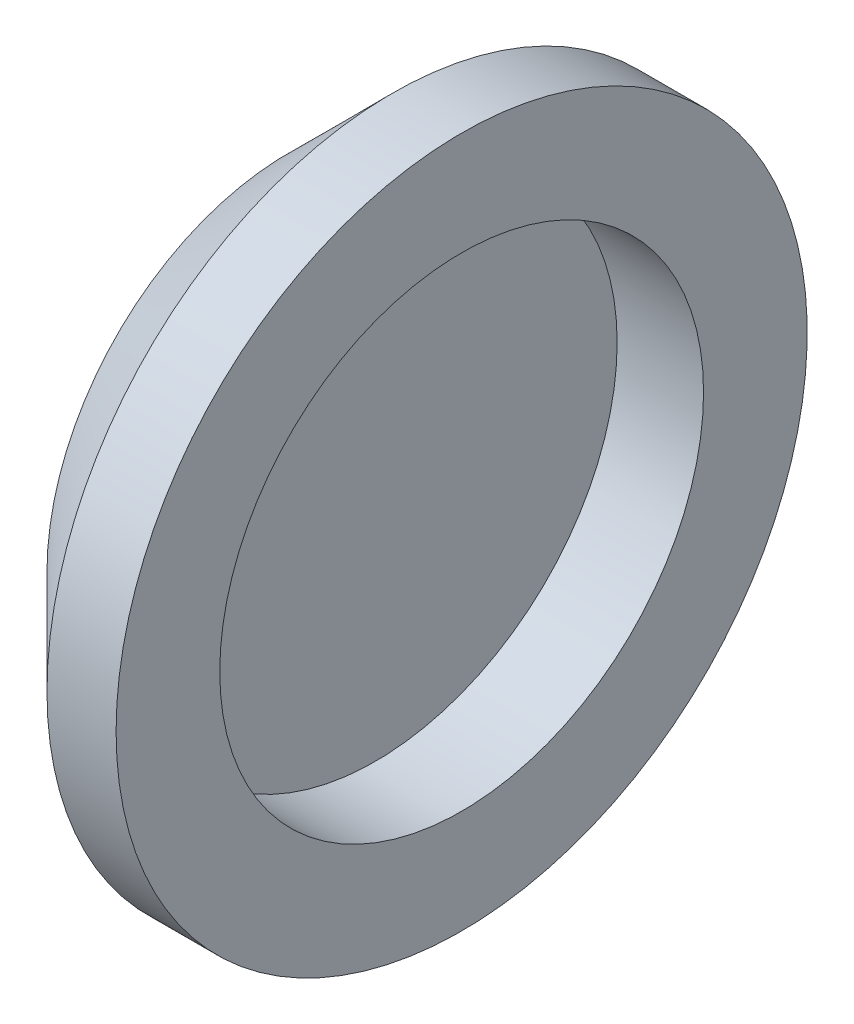
ISO-10303-21;
HEADER;
FILE_DESCRIPTION(('STEP AP214'),'2;1');
FILE_NAME('part.step','',(''),(''),'','','');
FILE_SCHEMA(('AUTOMOTIVE_DESIGN { 1 0 10303 214 1 1 1 1 }'));
ENDSEC;
DATA;
#1=APPLICATION_CONTEXT('core data for automotive mechanical design processes');
#2=APPLICATION_PROTOCOL_DEFINITION('international standard','automotive_design',2000,#1);
#3=PRODUCT_CONTEXT('',#1,'mechanical');
#4=PRODUCT('Part','Part','',(#3));
#5=PRODUCT_RELATED_PRODUCT_CATEGORY('part','',(#4));
#6=PRODUCT_DEFINITION_FORMATION('','',#4);
#7=PRODUCT_DEFINITION_CONTEXT('part definition',#1,'design');
#8=PRODUCT_DEFINITION('design','',#6,#7);
#9=PRODUCT_DEFINITION_SHAPE('','',#8);
#10=(LENGTH_UNIT() NAMED_UNIT(*) SI_UNIT(.MILLI.,.METRE.));
#11=(NAMED_UNIT(*) PLANE_ANGLE_UNIT() SI_UNIT($,.RADIAN.));
#12=(NAMED_UNIT(*) SI_UNIT($,.STERADIAN.) SOLID_ANGLE_UNIT());
#13=UNCERTAINTY_MEASURE_WITH_UNIT(LENGTH_MEASURE(1.E-05),#10,'distance_accuracy_value','');
#14=(GEOMETRIC_REPRESENTATION_CONTEXT(3) GLOBAL_UNCERTAINTY_ASSIGNED_CONTEXT((#13)) GLOBAL_UNIT_ASSIGNED_CONTEXT((#10,
#11,#12)) REPRESENTATION_CONTEXT('',''));
#15=CARTESIAN_POINT('',(0.,0.,0.));
#16=DIRECTION('',(0.,0.,1.));
#17=DIRECTION('',(1.,0.,0.));
#18=AXIS2_PLACEMENT_3D('',#15,#16,#17);
#19=CARTESIAN_POINT('',(0.,0.,0.));
#20=DIRECTION('',(-1.,0.,0.));
#21=DIRECTION('',(0.,0.,1.));
#22=AXIS2_PLACEMENT_3D('',#19,#20,#21);
#23=PLANE('',#22);
#24=CARTESIAN_POINT('',(0.,0.,0.));
#25=DIRECTION('',(1.,0.,0.));
#26=DIRECTION('',(0.,0.,-1.));
#27=AXIS2_PLACEMENT_3D('',#24,#25,#26);
#28=CIRCLE('',#27,3.556);
#29=CARTESIAN_POINT('',(0.,0.,-3.556));
#30=VERTEX_POINT('',#29);
#31=EDGE_CURVE('E63',#30,#30,#28,.T.);
#32=ORIENTED_EDGE('',*,*,#31,.F.);
#33=EDGE_LOOP('',(#32));
#34=FACE_BOUND('',#33,.T.);
#35=CARTESIAN_POINT('',(0.,0.,0.));
#36=DIRECTION('',(-1.,0.,0.));
#37=DIRECTION('',(0.,0.,1.));
#38=AXIS2_PLACEMENT_3D('',#35,#36,#37);
#39=CIRCLE('',#38,5.08);
#40=CARTESIAN_POINT('',(0.,0.,5.08));
#41=VERTEX_POINT('',#40);
#42=EDGE_CURVE('E10',#41,#41,#39,.T.);
#43=ORIENTED_EDGE('',*,*,#42,.F.);
#44=EDGE_LOOP('',(#43));
#45=FACE_BOUND('',#44,.T.);
#46=ADVANCED_FACE('F43',(#34,#45),#23,.F.);
#47=CARTESIAN_POINT('',(-2.54,0.,0.));
#48=DIRECTION('',(-1.,0.,0.));
#49=DIRECTION('',(0.,0.,1.));
#50=AXIS2_PLACEMENT_3D('',#47,#48,#49);
#51=CYLINDRICAL_SURFACE('',#50,5.08);
#52=CARTESIAN_POINT('',(-1.016,0.,0.));
#53=DIRECTION('',(-1.,0.,0.));
#54=DIRECTION('',(0.,0.,1.));
#55=AXIS2_PLACEMENT_3D('',#52,#53,#54);
#56=CIRCLE('',#55,5.08);
#57=CARTESIAN_POINT('',(-1.016,0.,5.08));
#58=VERTEX_POINT('',#57);
#59=EDGE_CURVE('E50',#58,#58,#56,.T.);
#60=ORIENTED_EDGE('',*,*,#59,.F.);
#61=EDGE_LOOP('',(#60));
#62=FACE_BOUND('',#61,.T.);
#63=ORIENTED_EDGE('',*,*,#42,.T.);
#64=EDGE_LOOP('',(#63));
#65=FACE_BOUND('',#64,.T.);
#66=ADVANCED_FACE('F82',(#62,#65),#51,.T.);
#67=CARTESIAN_POINT('',(-1.016,0.,0.));
#68=DIRECTION('',(1.,0.,0.));
#69=DIRECTION('',(0.,0.,-1.));
#70=AXIS2_PLACEMENT_3D('',#67,#68,#69);
#71=CONICAL_SURFACE('',#70,5.08,0.785398163397449);
#72=CARTESIAN_POINT('',(-2.54,0.,0.));
#73=DIRECTION('',(-1.,0.,0.));
#74=DIRECTION('',(0.,0.,1.));
#75=AXIS2_PLACEMENT_3D('',#72,#73,#74);
#76=CIRCLE('',#75,3.556);
#77=CARTESIAN_POINT('',(-2.54,0.,3.556));
#78=VERTEX_POINT('',#77);
#79=EDGE_CURVE('E55',#78,#78,#76,.T.);
#80=ORIENTED_EDGE('',*,*,#79,.F.);
#81=EDGE_LOOP('',(#80));
#82=FACE_BOUND('',#81,.T.);
#83=ORIENTED_EDGE('',*,*,#59,.T.);
#84=EDGE_LOOP('',(#83));
#85=FACE_BOUND('',#84,.T.);
#86=ADVANCED_FACE('F87',(#82,#85),#71,.T.);
#87=CARTESIAN_POINT('',(-2.54,3.556,0.));
#88=DIRECTION('',(1.,0.,0.));
#89=DIRECTION('',(0.,0.,-1.));
#90=AXIS2_PLACEMENT_3D('',#87,#88,#89);
#91=PLANE('',#90);
#92=ORIENTED_EDGE('',*,*,#79,.T.);
#93=EDGE_LOOP('',(#92));
#94=FACE_BOUND('',#93,.T.);
#95=ADVANCED_FACE('F76',(#94),#91,.F.);
#96=CARTESIAN_POINT('',(-1.27,0.,0.));
#97=DIRECTION('',(1.,0.,0.));
#98=DIRECTION('',(0.,0.,-1.));
#99=AXIS2_PLACEMENT_3D('',#96,#97,#98);
#100=CYLINDRICAL_SURFACE('',#99,3.556);
#101=CARTESIAN_POINT('',(-1.27,0.,0.));
#102=DIRECTION('',(1.,0.,0.));
#103=DIRECTION('',(0.,0.,-1.));
#104=AXIS2_PLACEMENT_3D('',#101,#102,#103);
#105=CIRCLE('',#104,3.556);
#106=CARTESIAN_POINT('',(-1.27,0.,-3.556));
#107=VERTEX_POINT('',#106);
#108=EDGE_CURVE('E60',#107,#107,#105,.T.);
#109=ORIENTED_EDGE('',*,*,#108,.F.);
#110=EDGE_LOOP('',(#109));
#111=FACE_BOUND('',#110,.T.);
#112=ORIENTED_EDGE('',*,*,#31,.T.);
#113=EDGE_LOOP('',(#112));
#114=FACE_BOUND('',#113,.T.);
#115=ADVANCED_FACE('F73',(#111,#114),#100,.F.);
#116=CARTESIAN_POINT('',(-1.27,0.,0.));
#117=DIRECTION('',(1.,0.,0.));
#118=DIRECTION('',(0.,0.,-1.));
#119=AXIS2_PLACEMENT_3D('',#116,#117,#118);
#120=PLANE('',#119);
#121=ORIENTED_EDGE('',*,*,#108,.T.);
#122=EDGE_LOOP('',(#121));
#123=FACE_BOUND('',#122,.T.);
#124=ADVANCED_FACE('F71',(#123),#120,.T.);
#125=CLOSED_SHELL('',(#46,#66,#86,#95,#115,#124));
#126=MANIFOLD_SOLID_BREP('B2',#125);
#127=ADVANCED_BREP_SHAPE_REPRESENTATION('',(#18,#126),#14);
#128=SHAPE_DEFINITION_REPRESENTATION(#9,#127);
ENDSEC;
END-ISO-10303-21;
